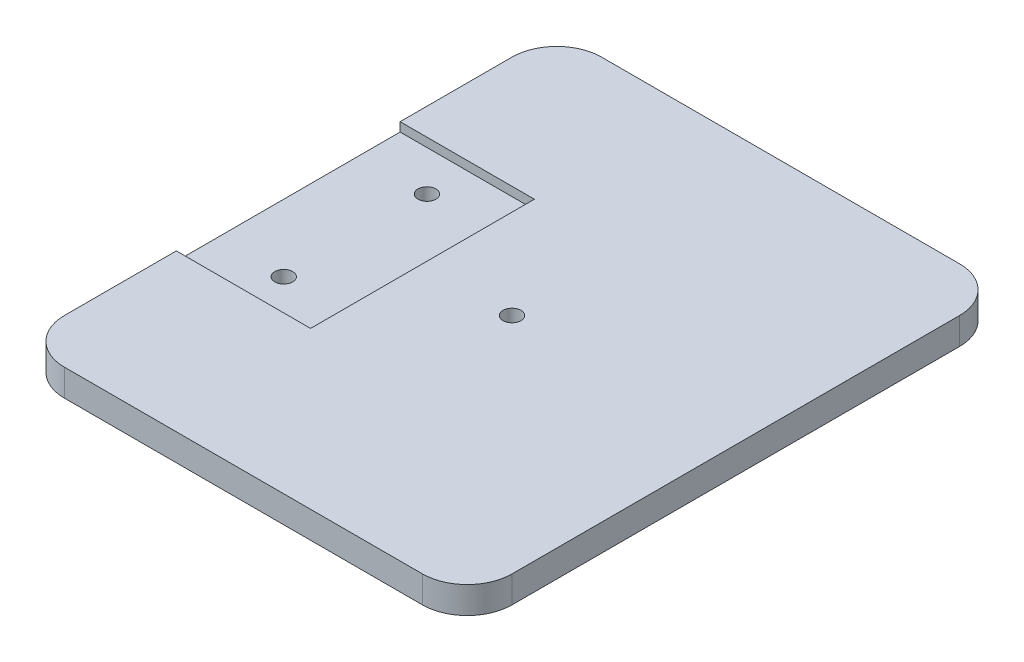
ISO-10303-21;
HEADER;
FILE_DESCRIPTION(('STEP AP214'),'2;1');
FILE_NAME('part.step','',(''),(''),'','','');
FILE_SCHEMA(('AUTOMOTIVE_DESIGN { 1 0 10303 214 1 1 1 1 }'));
ENDSEC;
DATA;
#1=APPLICATION_CONTEXT('core data for automotive mechanical design processes');
#2=APPLICATION_PROTOCOL_DEFINITION('international standard','automotive_design',2000,#1);
#3=PRODUCT_CONTEXT('',#1,'mechanical');
#4=PRODUCT('Part','Part','',(#3));
#5=PRODUCT_RELATED_PRODUCT_CATEGORY('part','',(#4));
#6=PRODUCT_DEFINITION_FORMATION('','',#4);
#7=PRODUCT_DEFINITION_CONTEXT('part definition',#1,'design');
#8=PRODUCT_DEFINITION('design','',#6,#7);
#9=PRODUCT_DEFINITION_SHAPE('','',#8);
#10=(LENGTH_UNIT() NAMED_UNIT(*) SI_UNIT(.MILLI.,.METRE.));
#11=(NAMED_UNIT(*) PLANE_ANGLE_UNIT() SI_UNIT($,.RADIAN.));
#12=(NAMED_UNIT(*) SI_UNIT($,.STERADIAN.) SOLID_ANGLE_UNIT());
#13=UNCERTAINTY_MEASURE_WITH_UNIT(LENGTH_MEASURE(1.E-05),#10,'distance_accuracy_value','');
#14=(GEOMETRIC_REPRESENTATION_CONTEXT(3) GLOBAL_UNCERTAINTY_ASSIGNED_CONTEXT((#13)) GLOBAL_UNIT_ASSIGNED_CONTEXT((#10,
#11,#12)) REPRESENTATION_CONTEXT('',''));
#15=CARTESIAN_POINT('',(0.,0.,0.));
#16=DIRECTION('',(0.,0.,1.));
#17=DIRECTION('',(1.,0.,0.));
#18=AXIS2_PLACEMENT_3D('',#15,#16,#17);
#19=CARTESIAN_POINT('',(8.96208235626153,3.,26.6959509145315));
#20=DIRECTION('',(0.,-1.,0.));
#21=DIRECTION('',(0.,0.,-1.));
#22=AXIS2_PLACEMENT_3D('',#19,#20,#21);
#23=CYLINDRICAL_SURFACE('',#22,5.);
#24=CARTESIAN_POINT('',(8.96208235626153,0.,26.6959509145315));
#25=DIRECTION('',(0.,1.,0.));
#26=DIRECTION('',(0.,0.,1.));
#27=AXIS2_PLACEMENT_3D('',#24,#25,#26);
#28=CIRCLE('',#27,5.);
#29=CARTESIAN_POINT('',(8.9620823562615,0.,31.6959509145315));
#30=VERTEX_POINT('',#29);
#31=CARTESIAN_POINT('',(13.9620823562615,0.,26.6959509145315));
#32=VERTEX_POINT('',#31);
#33=EDGE_CURVE('E161',#30,#32,#28,.T.);
#34=ORIENTED_EDGE('',*,*,#33,.T.);
#35=DIRECTION('',(0.,-1.,0.));
#36=VECTOR('',#35,1.);
#37=CARTESIAN_POINT('',(13.9620823562615,3.,26.6959509145315));
#38=LINE('',#37,#36);
#39=CARTESIAN_POINT('',(13.9620823562615,3.,26.6959509145315));
#40=VERTEX_POINT('',#39);
#41=EDGE_CURVE('E11',#40,#32,#38,.T.);
#42=ORIENTED_EDGE('',*,*,#41,.F.);
#43=CARTESIAN_POINT('',(8.96208235626153,3.,26.6959509145315));
#44=DIRECTION('',(0.,1.,0.));
#45=DIRECTION('',(0.,0.,1.));
#46=AXIS2_PLACEMENT_3D('',#43,#44,#45);
#47=CIRCLE('',#46,5.);
#48=CARTESIAN_POINT('',(8.9620823562615,3.,31.6959509145315));
#49=VERTEX_POINT('',#48);
#50=EDGE_CURVE('E185',#49,#40,#47,.T.);
#51=ORIENTED_EDGE('',*,*,#50,.F.);
#52=DIRECTION('',(0.,-1.,0.));
#53=VECTOR('',#52,1.);
#54=CARTESIAN_POINT('',(8.9620823562615,3.,31.6959509145315));
#55=LINE('',#54,#53);
#56=EDGE_CURVE('E156',#49,#30,#55,.T.);
#57=ORIENTED_EDGE('',*,*,#56,.T.);
#58=EDGE_LOOP('',(#34,#42,#51,#57));
#59=FACE_BOUND('',#58,.T.);
#60=ADVANCED_FACE('F43',(#59),#23,.T.);
#61=CARTESIAN_POINT('',(13.9620823562615,3.,-23.3040490854684));
#62=DIRECTION('',(-1.,0.,0.));
#63=DIRECTION('',(0.,0.,1.));
#64=AXIS2_PLACEMENT_3D('',#61,#62,#63);
#65=PLANE('',#64);
#66=DIRECTION('',(0.,0.,-1.));
#67=VECTOR('',#66,1.);
#68=CARTESIAN_POINT('',(13.9620823562615,0.,-23.3040490854684));
#69=LINE('',#68,#67);
#70=CARTESIAN_POINT('',(13.9620823562615,0.,-23.3040490854684));
#71=VERTEX_POINT('',#70);
#72=EDGE_CURVE('E165',#32,#71,#69,.T.);
#73=ORIENTED_EDGE('',*,*,#72,.T.);
#74=DIRECTION('',(0.,-1.,0.));
#75=VECTOR('',#74,1.);
#76=CARTESIAN_POINT('',(13.9620823562615,3.,-23.3040490854684));
#77=LINE('',#76,#75);
#78=CARTESIAN_POINT('',(13.9620823562615,3.,-23.3040490854684));
#79=VERTEX_POINT('',#78);
#80=EDGE_CURVE('E51',#79,#71,#77,.T.);
#81=ORIENTED_EDGE('',*,*,#80,.F.);
#82=DIRECTION('',(0.,0.,-1.));
#83=VECTOR('',#82,1.);
#84=CARTESIAN_POINT('',(13.9620823562615,3.,-23.3040490854684));
#85=LINE('',#84,#83);
#86=EDGE_CURVE('E108',#40,#79,#85,.T.);
#87=ORIENTED_EDGE('',*,*,#86,.F.);
#88=ORIENTED_EDGE('',*,*,#41,.T.);
#89=EDGE_LOOP('',(#73,#81,#87,#88));
#90=FACE_BOUND('',#89,.T.);
#91=ADVANCED_FACE('F317',(#90),#65,.F.);
#92=CARTESIAN_POINT('',(8.96208235626152,3.,-23.3040490854685));
#93=DIRECTION('',(0.,-1.,0.));
#94=DIRECTION('',(0.,0.,-1.));
#95=AXIS2_PLACEMENT_3D('',#92,#93,#94);
#96=CYLINDRICAL_SURFACE('',#95,5.);
#97=CARTESIAN_POINT('',(8.96208235626152,0.,-23.3040490854685));
#98=DIRECTION('',(0.,1.,0.));
#99=DIRECTION('',(0.,0.,-1.));
#100=AXIS2_PLACEMENT_3D('',#97,#98,#99);
#101=CIRCLE('',#100,5.);
#102=CARTESIAN_POINT('',(8.96208235626148,0.,-28.3040490854685));
#103=VERTEX_POINT('',#102);
#104=EDGE_CURVE('E169',#71,#103,#101,.T.);
#105=ORIENTED_EDGE('',*,*,#104,.T.);
#106=DIRECTION('',(0.,-1.,0.));
#107=VECTOR('',#106,1.);
#108=CARTESIAN_POINT('',(8.96208235626148,3.,-28.3040490854685));
#109=LINE('',#108,#107);
#110=CARTESIAN_POINT('',(8.96208235626148,3.,-28.3040490854685));
#111=VERTEX_POINT('',#110);
#112=EDGE_CURVE('E196',#111,#103,#109,.T.);
#113=ORIENTED_EDGE('',*,*,#112,.F.);
#114=CARTESIAN_POINT('',(8.96208235626152,3.,-23.3040490854685));
#115=DIRECTION('',(0.,1.,0.));
#116=DIRECTION('',(0.,0.,-1.));
#117=AXIS2_PLACEMENT_3D('',#114,#115,#116);
#118=CIRCLE('',#117,5.);
#119=EDGE_CURVE('E206',#79,#111,#118,.T.);
#120=ORIENTED_EDGE('',*,*,#119,.F.);
#121=ORIENTED_EDGE('',*,*,#80,.T.);
#122=EDGE_LOOP('',(#105,#113,#120,#121));
#123=FACE_BOUND('',#122,.T.);
#124=ADVANCED_FACE('F204',(#123),#96,.T.);
#125=CARTESIAN_POINT('',(-31.0379176437384,3.,-28.3040490854685));
#126=DIRECTION('',(0.,0.,1.));
#127=DIRECTION('',(1.,0.,0.));
#128=AXIS2_PLACEMENT_3D('',#125,#126,#127);
#129=PLANE('',#128);
#130=DIRECTION('',(-1.,0.,0.));
#131=VECTOR('',#130,1.);
#132=CARTESIAN_POINT('',(-31.0379176437384,0.,-28.3040490854685));
#133=LINE('',#132,#131);
#134=CARTESIAN_POINT('',(-31.0379176437384,0.,-28.3040490854685));
#135=VERTEX_POINT('',#134);
#136=EDGE_CURVE('E172',#103,#135,#133,.T.);
#137=ORIENTED_EDGE('',*,*,#136,.T.);
#138=DIRECTION('',(0.,-1.,0.));
#139=VECTOR('',#138,1.);
#140=CARTESIAN_POINT('',(-31.0379176437384,3.,-28.3040490854685));
#141=LINE('',#140,#139);
#142=CARTESIAN_POINT('',(-31.0379176437384,3.,-28.3040490854685));
#143=VERTEX_POINT('',#142);
#144=EDGE_CURVE('E192',#143,#135,#141,.T.);
#145=ORIENTED_EDGE('',*,*,#144,.F.);
#146=DIRECTION('',(-1.,0.,0.));
#147=VECTOR('',#146,1.);
#148=CARTESIAN_POINT('',(-31.0379176437384,3.,-28.3040490854685));
#149=LINE('',#148,#147);
#150=EDGE_CURVE('E222',#111,#143,#149,.T.);
#151=ORIENTED_EDGE('',*,*,#150,.F.);
#152=ORIENTED_EDGE('',*,*,#112,.T.);
#153=EDGE_LOOP('',(#137,#145,#151,#152));
#154=FACE_BOUND('',#153,.T.);
#155=ADVANCED_FACE('F214',(#154),#129,.F.);
#156=CARTESIAN_POINT('',(-31.0379176437385,3.,-23.3040490854685));
#157=DIRECTION('',(0.,-1.,0.));
#158=DIRECTION('',(0.,0.,-1.));
#159=AXIS2_PLACEMENT_3D('',#156,#157,#158);
#160=CYLINDRICAL_SURFACE('',#159,5.);
#161=CARTESIAN_POINT('',(-31.0379176437385,0.,-23.3040490854685));
#162=DIRECTION('',(0.,1.,0.));
#163=DIRECTION('',(0.,0.,1.));
#164=AXIS2_PLACEMENT_3D('',#161,#162,#163);
#165=CIRCLE('',#164,5.);
#166=CARTESIAN_POINT('',(-36.0379176437385,0.,-23.3040490854684));
#167=VERTEX_POINT('',#166);
#168=EDGE_CURVE('E175',#135,#167,#165,.T.);
#169=ORIENTED_EDGE('',*,*,#168,.T.);
#170=DIRECTION('',(0.,-1.,0.));
#171=VECTOR('',#170,1.);
#172=CARTESIAN_POINT('',(-36.0379176437385,3.,-23.3040490854684));
#173=LINE('',#172,#171);
#174=CARTESIAN_POINT('',(-36.0379176437385,3.,-23.3040490854684));
#175=VERTEX_POINT('',#174);
#176=EDGE_CURVE('E148',#175,#167,#173,.T.);
#177=ORIENTED_EDGE('',*,*,#176,.F.);
#178=CARTESIAN_POINT('',(-31.0379176437385,3.,-23.3040490854685));
#179=DIRECTION('',(0.,1.,0.));
#180=DIRECTION('',(0.,0.,1.));
#181=AXIS2_PLACEMENT_3D('',#178,#179,#180);
#182=CIRCLE('',#181,5.);
#183=EDGE_CURVE('E136',#143,#175,#182,.T.);
#184=ORIENTED_EDGE('',*,*,#183,.F.);
#185=ORIENTED_EDGE('',*,*,#144,.T.);
#186=EDGE_LOOP('',(#169,#177,#184,#185));
#187=FACE_BOUND('',#186,.T.);
#188=ADVANCED_FACE('F218',(#187),#160,.T.);
#189=CARTESIAN_POINT('',(-36.0379176437385,3.,-23.3040490854684));
#190=DIRECTION('',(1.,0.,0.));
#191=DIRECTION('',(0.,0.,-1.));
#192=AXIS2_PLACEMENT_3D('',#189,#190,#191);
#193=PLANE('',#192);
#194=DIRECTION('',(0.,0.,1.));
#195=VECTOR('',#194,1.);
#196=CARTESIAN_POINT('',(-36.0379176437385,2.,-10.8040490854685));
#197=LINE('',#196,#195);
#198=CARTESIAN_POINT('',(-36.0379176437385,2.,-10.8040490854685));
#199=VERTEX_POINT('',#198);
#200=CARTESIAN_POINT('',(-36.0379176437385,2.,14.1959509145315));
#201=VERTEX_POINT('',#200);
#202=EDGE_CURVE('E250',#199,#201,#197,.T.);
#203=ORIENTED_EDGE('',*,*,#202,.F.);
#204=DIRECTION('',(0.,1.,0.));
#205=VECTOR('',#204,1.);
#206=CARTESIAN_POINT('',(-36.0379176437385,2.,-10.8040490854685));
#207=LINE('',#206,#205);
#208=CARTESIAN_POINT('',(-36.0379176437385,3.,-10.8040490854685));
#209=VERTEX_POINT('',#208);
#210=EDGE_CURVE('E166',#199,#209,#207,.T.);
#211=ORIENTED_EDGE('',*,*,#210,.T.);
#212=DIRECTION('',(0.,0.,1.));
#213=VECTOR('',#212,1.);
#214=CARTESIAN_POINT('',(-36.0379176437385,3.,-23.3040490854684));
#215=LINE('',#214,#213);
#216=EDGE_CURVE('E135',#175,#209,#215,.T.);
#217=ORIENTED_EDGE('',*,*,#216,.F.);
#218=ORIENTED_EDGE('',*,*,#176,.T.);
#219=DIRECTION('',(0.,0.,1.));
#220=VECTOR('',#219,1.);
#221=CARTESIAN_POINT('',(-36.0379176437385,0.,-23.3040490854684));
#222=LINE('',#221,#220);
#223=CARTESIAN_POINT('',(-36.0379176437385,0.,26.6959509145315));
#224=VERTEX_POINT('',#223);
#225=EDGE_CURVE('E144',#167,#224,#222,.T.);
#226=ORIENTED_EDGE('',*,*,#225,.T.);
#227=DIRECTION('',(0.,-1.,0.));
#228=VECTOR('',#227,1.);
#229=CARTESIAN_POINT('',(-36.0379176437385,3.,26.6959509145315));
#230=LINE('',#229,#228);
#231=CARTESIAN_POINT('',(-36.0379176437385,3.,26.6959509145315));
#232=VERTEX_POINT('',#231);
#233=EDGE_CURVE('E139',#232,#224,#230,.T.);
#234=ORIENTED_EDGE('',*,*,#233,.F.);
#235=CARTESIAN_POINT('',(-36.0379176437385,3.,14.1959509145315));
#236=VERTEX_POINT('',#235);
#237=EDGE_CURVE('E124',#236,#232,#215,.T.);
#238=ORIENTED_EDGE('',*,*,#237,.F.);
#239=DIRECTION('',(0.,1.,0.));
#240=VECTOR('',#239,1.);
#241=CARTESIAN_POINT('',(-36.0379176437385,2.,14.1959509145315));
#242=LINE('',#241,#240);
#243=EDGE_CURVE('E58',#201,#236,#242,.T.);
#244=ORIENTED_EDGE('',*,*,#243,.F.);
#245=EDGE_LOOP('',(#203,#211,#217,#218,#226,#234,#238,#244));
#246=FACE_BOUND('',#245,.T.);
#247=ADVANCED_FACE('F141',(#246),#193,.F.);
#248=CARTESIAN_POINT('',(-31.0379176437385,3.,26.6959509145315));
#249=DIRECTION('',(0.,-1.,0.));
#250=DIRECTION('',(0.,0.,-1.));
#251=AXIS2_PLACEMENT_3D('',#248,#249,#250);
#252=CYLINDRICAL_SURFACE('',#251,5.);
#253=CARTESIAN_POINT('',(-31.0379176437385,0.,26.6959509145315));
#254=DIRECTION('',(0.,1.,0.));
#255=DIRECTION('',(0.,0.,1.));
#256=AXIS2_PLACEMENT_3D('',#253,#254,#255);
#257=CIRCLE('',#256,5.);
#258=CARTESIAN_POINT('',(-31.0379176437384,0.,31.6959509145315));
#259=VERTEX_POINT('',#258);
#260=EDGE_CURVE('E180',#224,#259,#257,.T.);
#261=ORIENTED_EDGE('',*,*,#260,.T.);
#262=DIRECTION('',(0.,-1.,0.));
#263=VECTOR('',#262,1.);
#264=CARTESIAN_POINT('',(-31.0379176437384,3.,31.6959509145315));
#265=LINE('',#264,#263);
#266=CARTESIAN_POINT('',(-31.0379176437384,3.,31.6959509145315));
#267=VERTEX_POINT('',#266);
#268=EDGE_CURVE('E149',#267,#259,#265,.T.);
#269=ORIENTED_EDGE('',*,*,#268,.F.);
#270=CARTESIAN_POINT('',(-31.0379176437385,3.,26.6959509145315));
#271=DIRECTION('',(0.,1.,0.));
#272=DIRECTION('',(0.,0.,1.));
#273=AXIS2_PLACEMENT_3D('',#270,#271,#272);
#274=CIRCLE('',#273,5.);
#275=EDGE_CURVE('E129',#232,#267,#274,.T.);
#276=ORIENTED_EDGE('',*,*,#275,.F.);
#277=ORIENTED_EDGE('',*,*,#233,.T.);
#278=EDGE_LOOP('',(#261,#269,#276,#277));
#279=FACE_BOUND('',#278,.T.);
#280=ADVANCED_FACE('F151',(#279),#252,.T.);
#281=CARTESIAN_POINT('',(-31.0379176437384,3.,31.6959509145315));
#282=DIRECTION('',(0.,0.,-1.));
#283=DIRECTION('',(-1.,0.,0.));
#284=AXIS2_PLACEMENT_3D('',#281,#282,#283);
#285=PLANE('',#284);
#286=DIRECTION('',(1.,0.,0.));
#287=VECTOR('',#286,1.);
#288=CARTESIAN_POINT('',(-31.0379176437384,0.,31.6959509145315));
#289=LINE('',#288,#287);
#290=EDGE_CURVE('E100',#259,#30,#289,.T.);
#291=ORIENTED_EDGE('',*,*,#290,.T.);
#292=ORIENTED_EDGE('',*,*,#56,.F.);
#293=DIRECTION('',(1.,0.,0.));
#294=VECTOR('',#293,1.);
#295=CARTESIAN_POINT('',(-31.0379176437384,3.,31.6959509145315));
#296=LINE('',#295,#294);
#297=EDGE_CURVE('E67',#267,#49,#296,.T.);
#298=ORIENTED_EDGE('',*,*,#297,.F.);
#299=ORIENTED_EDGE('',*,*,#268,.T.);
#300=EDGE_LOOP('',(#291,#292,#298,#299));
#301=FACE_BOUND('',#300,.T.);
#302=ADVANCED_FACE('F306',(#301),#285,.F.);
#303=CARTESIAN_POINT('',(8.96208235626153,3.,26.6959509145315));
#304=DIRECTION('',(0.,1.,0.));
#305=DIRECTION('',(0.,0.,1.));
#306=AXIS2_PLACEMENT_3D('',#303,#304,#305);
#307=PLANE('',#306);
#308=CARTESIAN_POINT('',(-11.0379176437385,3.,1.69595091453151));
#309=DIRECTION('',(0.,1.,0.));
#310=DIRECTION('',(0.,0.,1.));
#311=AXIS2_PLACEMENT_3D('',#308,#309,#310);
#312=CIRCLE('',#311,1.);
#313=CARTESIAN_POINT('',(-11.0379176437385,3.,2.69595091453152));
#314=VERTEX_POINT('',#313);
#315=EDGE_CURVE('E288',#314,#314,#312,.T.);
#316=ORIENTED_EDGE('',*,*,#315,.F.);
#317=EDGE_LOOP('',(#316));
#318=FACE_BOUND('',#317,.T.);
#319=DIRECTION('',(-1.,0.,0.));
#320=VECTOR('',#319,1.);
#321=CARTESIAN_POINT('',(-36.0379176437385,3.,-10.8040490854685));
#322=LINE('',#321,#320);
#323=CARTESIAN_POINT('',(-21.0379176437385,3.,-10.8040490854685));
#324=VERTEX_POINT('',#323);
#325=EDGE_CURVE('E246',#324,#209,#322,.T.);
#326=ORIENTED_EDGE('',*,*,#325,.F.);
#327=DIRECTION('',(0.,0.,-1.));
#328=VECTOR('',#327,1.);
#329=CARTESIAN_POINT('',(-21.0379176437385,3.,-10.8040490854685));
#330=LINE('',#329,#328);
#331=CARTESIAN_POINT('',(-21.0379176437385,3.,14.1959509145315));
#332=VERTEX_POINT('',#331);
#333=EDGE_CURVE('E251',#332,#324,#330,.T.);
#334=ORIENTED_EDGE('',*,*,#333,.F.);
#335=DIRECTION('',(1.,0.,0.));
#336=VECTOR('',#335,1.);
#337=CARTESIAN_POINT('',(-36.0379176437385,3.,14.1959509145315));
#338=LINE('',#337,#336);
#339=EDGE_CURVE('E132',#236,#332,#338,.T.);
#340=ORIENTED_EDGE('',*,*,#339,.F.);
#341=ORIENTED_EDGE('',*,*,#237,.T.);
#342=ORIENTED_EDGE('',*,*,#275,.T.);
#343=ORIENTED_EDGE('',*,*,#297,.T.);
#344=ORIENTED_EDGE('',*,*,#50,.T.);
#345=ORIENTED_EDGE('',*,*,#86,.T.);
#346=ORIENTED_EDGE('',*,*,#119,.T.);
#347=ORIENTED_EDGE('',*,*,#150,.T.);
#348=ORIENTED_EDGE('',*,*,#183,.T.);
#349=ORIENTED_EDGE('',*,*,#216,.T.);
#350=EDGE_LOOP('',(#326,#334,#340,#341,#342,#343,#344,#345,#346,#347,#348,#349));
#351=FACE_BOUND('',#350,.T.);
#352=ADVANCED_FACE('F127',(#318,#351),#307,.T.);
#353=CARTESIAN_POINT('',(8.96208235626153,0.,26.6959509145315));
#354=DIRECTION('',(0.,1.,0.));
#355=DIRECTION('',(0.,0.,1.));
#356=AXIS2_PLACEMENT_3D('',#353,#354,#355);
#357=PLANE('',#356);
#358=CARTESIAN_POINT('',(-11.0379176437385,0.,1.69595091453151));
#359=DIRECTION('',(0.,1.,0.));
#360=DIRECTION('',(0.,0.,1.));
#361=AXIS2_PLACEMENT_3D('',#358,#359,#360);
#362=CIRCLE('',#361,1.);
#363=CARTESIAN_POINT('',(-11.0379176437385,0.,2.69595091453152));
#364=VERTEX_POINT('',#363);
#365=EDGE_CURVE('E277',#364,#364,#362,.T.);
#366=ORIENTED_EDGE('',*,*,#365,.T.);
#367=EDGE_LOOP('',(#366));
#368=FACE_BOUND('',#367,.T.);
#369=CARTESIAN_POINT('',(-28.5379176437385,0.,-6.30404908546848));
#370=DIRECTION('',(0.,1.,0.));
#371=DIRECTION('',(0.,0.,1.));
#372=AXIS2_PLACEMENT_3D('',#369,#370,#371);
#373=CIRCLE('',#372,1.);
#374=CARTESIAN_POINT('',(-28.5379176437385,0.,-5.30404908546848));
#375=VERTEX_POINT('',#374);
#376=EDGE_CURVE('E257',#375,#375,#373,.T.);
#377=ORIENTED_EDGE('',*,*,#376,.T.);
#378=EDGE_LOOP('',(#377));
#379=FACE_BOUND('',#378,.T.);
#380=CARTESIAN_POINT('',(-28.5379176437385,0.,9.69595091453152));
#381=DIRECTION('',(0.,1.,0.));
#382=DIRECTION('',(0.,0.,1.));
#383=AXIS2_PLACEMENT_3D('',#380,#381,#382);
#384=CIRCLE('',#383,1.);
#385=CARTESIAN_POINT('',(-28.5379176437385,0.,10.6959509145315));
#386=VERTEX_POINT('',#385);
#387=EDGE_CURVE('E272',#386,#386,#384,.T.);
#388=ORIENTED_EDGE('',*,*,#387,.T.);
#389=EDGE_LOOP('',(#388));
#390=FACE_BOUND('',#389,.T.);
#391=ORIENTED_EDGE('',*,*,#33,.F.);
#392=ORIENTED_EDGE('',*,*,#290,.F.);
#393=ORIENTED_EDGE('',*,*,#260,.F.);
#394=ORIENTED_EDGE('',*,*,#225,.F.);
#395=ORIENTED_EDGE('',*,*,#168,.F.);
#396=ORIENTED_EDGE('',*,*,#136,.F.);
#397=ORIENTED_EDGE('',*,*,#104,.F.);
#398=ORIENTED_EDGE('',*,*,#72,.F.);
#399=EDGE_LOOP('',(#391,#392,#393,#394,#395,#396,#397,#398));
#400=FACE_BOUND('',#399,.T.);
#401=ADVANCED_FACE('F210',(#368,#379,#390,#400),#357,.F.);
#402=CARTESIAN_POINT('',(-36.0379176437385,2.,-10.8040490854685));
#403=DIRECTION('',(0.,0.,-1.));
#404=DIRECTION('',(-1.,0.,0.));
#405=AXIS2_PLACEMENT_3D('',#402,#403,#404);
#406=PLANE('',#405);
#407=ORIENTED_EDGE('',*,*,#325,.T.);
#408=ORIENTED_EDGE('',*,*,#210,.F.);
#409=DIRECTION('',(-1.,0.,0.));
#410=VECTOR('',#409,1.);
#411=CARTESIAN_POINT('',(-36.0379176437385,2.,-10.8040490854685));
#412=LINE('',#411,#410);
#413=CARTESIAN_POINT('',(-21.0379176437385,2.,-10.8040490854685));
#414=VERTEX_POINT('',#413);
#415=EDGE_CURVE('E235',#414,#199,#412,.T.);
#416=ORIENTED_EDGE('',*,*,#415,.F.);
#417=DIRECTION('',(0.,1.,0.));
#418=VECTOR('',#417,1.);
#419=CARTESIAN_POINT('',(-21.0379176437385,2.,-10.8040490854685));
#420=LINE('',#419,#418);
#421=EDGE_CURVE('E239',#414,#324,#420,.T.);
#422=ORIENTED_EDGE('',*,*,#421,.T.);
#423=EDGE_LOOP('',(#407,#408,#416,#422));
#424=FACE_BOUND('',#423,.T.);
#425=ADVANCED_FACE('F312',(#424),#406,.F.);
#426=CARTESIAN_POINT('',(-21.0379176437385,2.,-10.8040490854685));
#427=DIRECTION('',(1.,0.,0.));
#428=DIRECTION('',(0.,0.,-1.));
#429=AXIS2_PLACEMENT_3D('',#426,#427,#428);
#430=PLANE('',#429);
#431=ORIENTED_EDGE('',*,*,#333,.T.);
#432=ORIENTED_EDGE('',*,*,#421,.F.);
#433=DIRECTION('',(0.,0.,-1.));
#434=VECTOR('',#433,1.);
#435=CARTESIAN_POINT('',(-21.0379176437385,2.,-10.8040490854685));
#436=LINE('',#435,#434);
#437=CARTESIAN_POINT('',(-21.0379176437385,2.,14.1959509145315));
#438=VERTEX_POINT('',#437);
#439=EDGE_CURVE('E261',#438,#414,#436,.T.);
#440=ORIENTED_EDGE('',*,*,#439,.F.);
#441=DIRECTION('',(0.,1.,0.));
#442=VECTOR('',#441,1.);
#443=CARTESIAN_POINT('',(-21.0379176437385,2.,14.1959509145315));
#444=LINE('',#443,#442);
#445=EDGE_CURVE('E234',#438,#332,#444,.T.);
#446=ORIENTED_EDGE('',*,*,#445,.T.);
#447=EDGE_LOOP('',(#431,#432,#440,#446));
#448=FACE_BOUND('',#447,.T.);
#449=ADVANCED_FACE('F362',(#448),#430,.F.);
#450=CARTESIAN_POINT('',(-36.0379176437385,2.,14.1959509145315));
#451=DIRECTION('',(0.,0.,1.));
#452=DIRECTION('',(1.,0.,0.));
#453=AXIS2_PLACEMENT_3D('',#450,#451,#452);
#454=PLANE('',#453);
#455=ORIENTED_EDGE('',*,*,#339,.T.);
#456=ORIENTED_EDGE('',*,*,#445,.F.);
#457=DIRECTION('',(1.,0.,0.));
#458=VECTOR('',#457,1.);
#459=CARTESIAN_POINT('',(-36.0379176437385,2.,14.1959509145315));
#460=LINE('',#459,#458);
#461=EDGE_CURVE('E265',#201,#438,#460,.T.);
#462=ORIENTED_EDGE('',*,*,#461,.F.);
#463=ORIENTED_EDGE('',*,*,#243,.T.);
#464=EDGE_LOOP('',(#455,#456,#462,#463));
#465=FACE_BOUND('',#464,.T.);
#466=ADVANCED_FACE('F374',(#465),#454,.F.);
#467=CARTESIAN_POINT('',(0.,2.,0.));
#468=DIRECTION('',(0.,1.,0.));
#469=DIRECTION('',(0.,0.,1.));
#470=AXIS2_PLACEMENT_3D('',#467,#468,#469);
#471=PLANE('',#470);
#472=CARTESIAN_POINT('',(-28.5379176437385,2.,-6.30404908546848));
#473=DIRECTION('',(0.,1.,0.));
#474=DIRECTION('',(0.,0.,1.));
#475=AXIS2_PLACEMENT_3D('',#472,#473,#474);
#476=CIRCLE('',#475,1.);
#477=CARTESIAN_POINT('',(-28.5379176437385,2.,-5.30404908546848));
#478=VERTEX_POINT('',#477);
#479=EDGE_CURVE('E281',#478,#478,#476,.T.);
#480=ORIENTED_EDGE('',*,*,#479,.F.);
#481=EDGE_LOOP('',(#480));
#482=FACE_BOUND('',#481,.T.);
#483=CARTESIAN_POINT('',(-28.5379176437385,2.,9.69595091453152));
#484=DIRECTION('',(0.,1.,0.));
#485=DIRECTION('',(0.,0.,1.));
#486=AXIS2_PLACEMENT_3D('',#483,#484,#485);
#487=CIRCLE('',#486,1.);
#488=CARTESIAN_POINT('',(-28.5379176437385,2.,10.6959509145315));
#489=VERTEX_POINT('',#488);
#490=EDGE_CURVE('E276',#489,#489,#487,.T.);
#491=ORIENTED_EDGE('',*,*,#490,.F.);
#492=EDGE_LOOP('',(#491));
#493=FACE_BOUND('',#492,.T.);
#494=ORIENTED_EDGE('',*,*,#202,.T.);
#495=ORIENTED_EDGE('',*,*,#461,.T.);
#496=ORIENTED_EDGE('',*,*,#439,.T.);
#497=ORIENTED_EDGE('',*,*,#415,.T.);
#498=EDGE_LOOP('',(#494,#495,#496,#497));
#499=FACE_BOUND('',#498,.T.);
#500=ADVANCED_FACE('F385',(#482,#493,#499),#471,.T.);
#501=CARTESIAN_POINT('',(-28.5379176437385,0.,9.69595091453152));
#502=DIRECTION('',(0.,1.,0.));
#503=DIRECTION('',(0.,0.,1.));
#504=AXIS2_PLACEMENT_3D('',#501,#502,#503);
#505=CYLINDRICAL_SURFACE('',#504,1.);
#506=ORIENTED_EDGE('',*,*,#387,.F.);
#507=EDGE_LOOP('',(#506));
#508=FACE_BOUND('',#507,.T.);
#509=ORIENTED_EDGE('',*,*,#490,.T.);
#510=EDGE_LOOP('',(#509));
#511=FACE_BOUND('',#510,.T.);
#512=ADVANCED_FACE('F394',(#508,#511),#505,.F.);
#513=CARTESIAN_POINT('',(-28.5379176437385,0.,-6.30404908546848));
#514=DIRECTION('',(0.,1.,0.));
#515=DIRECTION('',(0.,0.,1.));
#516=AXIS2_PLACEMENT_3D('',#513,#514,#515);
#517=CYLINDRICAL_SURFACE('',#516,1.);
#518=ORIENTED_EDGE('',*,*,#376,.F.);
#519=EDGE_LOOP('',(#518));
#520=FACE_BOUND('',#519,.T.);
#521=ORIENTED_EDGE('',*,*,#479,.T.);
#522=EDGE_LOOP('',(#521));
#523=FACE_BOUND('',#522,.T.);
#524=ADVANCED_FACE('F301',(#520,#523),#517,.F.);
#525=CARTESIAN_POINT('',(-11.0379176437385,0.,1.69595091453151));
#526=DIRECTION('',(0.,1.,0.));
#527=DIRECTION('',(0.,0.,1.));
#528=AXIS2_PLACEMENT_3D('',#525,#526,#527);
#529=CYLINDRICAL_SURFACE('',#528,1.);
#530=ORIENTED_EDGE('',*,*,#365,.F.);
#531=EDGE_LOOP('',(#530));
#532=FACE_BOUND('',#531,.T.);
#533=ORIENTED_EDGE('',*,*,#315,.T.);
#534=EDGE_LOOP('',(#533));
#535=FACE_BOUND('',#534,.T.);
#536=ADVANCED_FACE('F298',(#532,#535),#529,.F.);
#537=CLOSED_SHELL('',(#60,#91,#124,#155,#188,#247,#280,#302,#352,#401,#425,#449,#466,#500,#512,
#524,#536));
#538=MANIFOLD_SOLID_BREP('B2',#537);
#539=ADVANCED_BREP_SHAPE_REPRESENTATION('',(#18,#538),#14);
#540=SHAPE_DEFINITION_REPRESENTATION(#9,#539);
ENDSEC;
END-ISO-10303-21;
